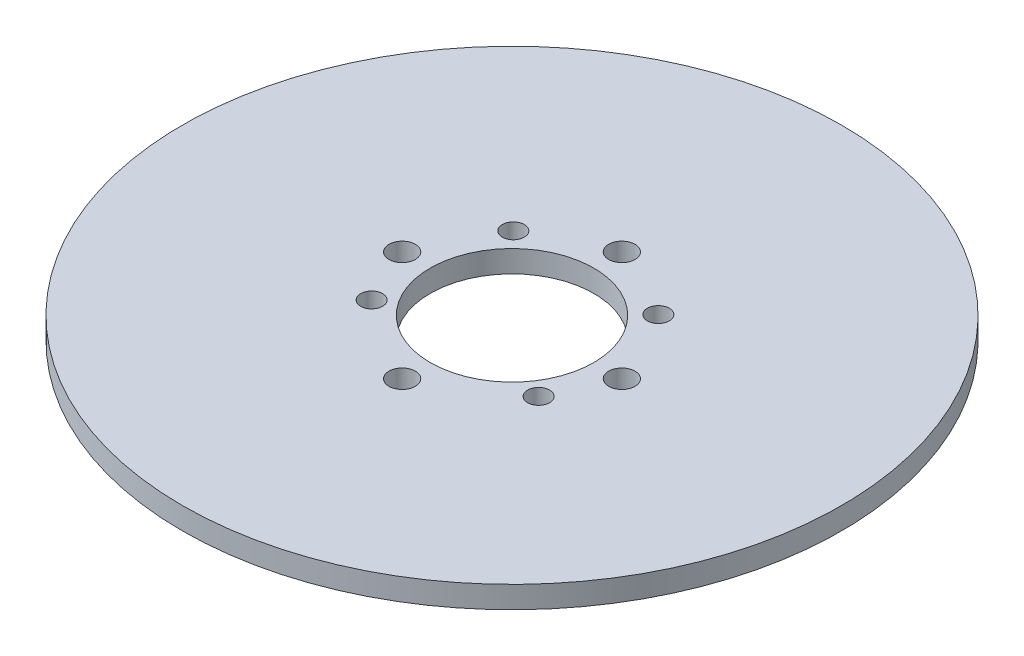
ISO-10303-21;
HEADER;
FILE_DESCRIPTION(('STEP AP214'),'2;1');
FILE_NAME('part.step','',(''),(''),'','','');
FILE_SCHEMA(('AUTOMOTIVE_DESIGN { 1 0 10303 214 1 1 1 1 }'));
ENDSEC;
DATA;
#1=APPLICATION_CONTEXT('core data for automotive mechanical design processes');
#2=APPLICATION_PROTOCOL_DEFINITION('international standard','automotive_design',2000,#1);
#3=PRODUCT_CONTEXT('',#1,'mechanical');
#4=PRODUCT('Part','Part','',(#3));
#5=PRODUCT_RELATED_PRODUCT_CATEGORY('part','',(#4));
#6=PRODUCT_DEFINITION_FORMATION('','',#4);
#7=PRODUCT_DEFINITION_CONTEXT('part definition',#1,'design');
#8=PRODUCT_DEFINITION('design','',#6,#7);
#9=PRODUCT_DEFINITION_SHAPE('','',#8);
#10=(LENGTH_UNIT() NAMED_UNIT(*) SI_UNIT(.MILLI.,.METRE.));
#11=(NAMED_UNIT(*) PLANE_ANGLE_UNIT() SI_UNIT($,.RADIAN.));
#12=(NAMED_UNIT(*) SI_UNIT($,.STERADIAN.) SOLID_ANGLE_UNIT());
#13=UNCERTAINTY_MEASURE_WITH_UNIT(LENGTH_MEASURE(1.E-05),#10,'distance_accuracy_value','');
#14=(GEOMETRIC_REPRESENTATION_CONTEXT(3) GLOBAL_UNCERTAINTY_ASSIGNED_CONTEXT((#13)) GLOBAL_UNIT_ASSIGNED_CONTEXT((#10,
#11,#12)) REPRESENTATION_CONTEXT('',''));
#15=CARTESIAN_POINT('',(0.,0.,0.));
#16=DIRECTION('',(0.,0.,1.));
#17=DIRECTION('',(1.,0.,0.));
#18=AXIS2_PLACEMENT_3D('',#15,#16,#17);
#19=CARTESIAN_POINT('',(-49.9999999999979,10.,3.00000000000159));
#20=DIRECTION('',(0.,-1.,0.));
#21=DIRECTION('',(0.,0.,-1.));
#22=AXIS2_PLACEMENT_3D('',#19,#20,#21);
#23=CYLINDRICAL_SURFACE('',#22,6.);
#24=CARTESIAN_POINT('',(-49.9999999999979,10.,3.00000000000159));
#25=DIRECTION('',(0.,1.,0.));
#26=DIRECTION('',(0.,0.,1.));
#27=AXIS2_PLACEMENT_3D('',#24,#25,#26);
#28=CIRCLE('',#27,6.);
#29=CARTESIAN_POINT('',(-49.9999999999979,10.,9.00000000000159));
#30=VERTEX_POINT('',#29);
#31=EDGE_CURVE('E41',#30,#30,#28,.T.);
#32=ORIENTED_EDGE('',*,*,#31,.T.);
#33=EDGE_LOOP('',(#32));
#34=FACE_BOUND('',#33,.T.);
#35=CARTESIAN_POINT('',(-49.9999999999979,0.,3.00000000000159));
#36=DIRECTION('',(0.,1.,0.));
#37=DIRECTION('',(0.,0.,1.));
#38=AXIS2_PLACEMENT_3D('',#35,#36,#37);
#39=CIRCLE('',#38,6.);
#40=CARTESIAN_POINT('',(-49.9999999999979,0.,9.00000000000159));
#41=VERTEX_POINT('',#40);
#42=EDGE_CURVE('E73',#41,#41,#39,.T.);
#43=ORIENTED_EDGE('',*,*,#42,.F.);
#44=EDGE_LOOP('',(#43));
#45=FACE_BOUND('',#44,.T.);
#46=ADVANCED_FACE('F33',(#34,#45),#23,.F.);
#47=CARTESIAN_POINT('',(3.89573857868908E-12,10.,53.));
#48=DIRECTION('',(0.,-1.,0.));
#49=DIRECTION('',(0.,0.,-1.));
#50=AXIS2_PLACEMENT_3D('',#47,#48,#49);
#51=CYLINDRICAL_SURFACE('',#50,6.);
#52=CARTESIAN_POINT('',(3.89573857868908E-12,10.,53.));
#53=DIRECTION('',(0.,1.,0.));
#54=DIRECTION('',(0.,0.,1.));
#55=AXIS2_PLACEMENT_3D('',#52,#53,#54);
#56=CIRCLE('',#55,6.);
#57=CARTESIAN_POINT('',(3.89573857868908E-12,10.,59.));
#58=VERTEX_POINT('',#57);
#59=EDGE_CURVE('E46',#58,#58,#56,.T.);
#60=ORIENTED_EDGE('',*,*,#59,.T.);
#61=EDGE_LOOP('',(#60));
#62=FACE_BOUND('',#61,.T.);
#63=CARTESIAN_POINT('',(3.89573857868908E-12,0.,53.));
#64=DIRECTION('',(0.,1.,0.));
#65=DIRECTION('',(0.,0.,1.));
#66=AXIS2_PLACEMENT_3D('',#63,#64,#65);
#67=CIRCLE('',#66,6.);
#68=CARTESIAN_POINT('',(3.89573857868908E-12,0.,59.));
#69=VERTEX_POINT('',#68);
#70=EDGE_CURVE('E71',#69,#69,#67,.T.);
#71=ORIENTED_EDGE('',*,*,#70,.F.);
#72=EDGE_LOOP('',(#71));
#73=FACE_BOUND('',#72,.T.);
#74=ADVANCED_FACE('F106',(#62,#73),#51,.F.);
#75=CARTESIAN_POINT('',(50.0000000000021,10.,2.99999999999806));
#76=DIRECTION('',(0.,-1.,0.));
#77=DIRECTION('',(0.,0.,-1.));
#78=AXIS2_PLACEMENT_3D('',#75,#76,#77);
#79=CYLINDRICAL_SURFACE('',#78,6.);
#80=CARTESIAN_POINT('',(50.0000000000021,10.,2.99999999999806));
#81=DIRECTION('',(0.,1.,0.));
#82=DIRECTION('',(0.,0.,1.));
#83=AXIS2_PLACEMENT_3D('',#80,#81,#82);
#84=CIRCLE('',#83,6.);
#85=CARTESIAN_POINT('',(50.0000000000021,10.,8.99999999999806));
#86=VERTEX_POINT('',#85);
#87=EDGE_CURVE('E101',#86,#86,#84,.T.);
#88=ORIENTED_EDGE('',*,*,#87,.T.);
#89=EDGE_LOOP('',(#88));
#90=FACE_BOUND('',#89,.T.);
#91=CARTESIAN_POINT('',(50.0000000000021,0.,2.99999999999806));
#92=DIRECTION('',(0.,1.,0.));
#93=DIRECTION('',(0.,0.,1.));
#94=AXIS2_PLACEMENT_3D('',#91,#92,#93);
#95=CIRCLE('',#94,6.);
#96=CARTESIAN_POINT('',(50.0000000000021,0.,8.99999999999806));
#97=VERTEX_POINT('',#96);
#98=EDGE_CURVE('E68',#97,#97,#95,.T.);
#99=ORIENTED_EDGE('',*,*,#98,.F.);
#100=EDGE_LOOP('',(#99));
#101=FACE_BOUND('',#100,.T.);
#102=ADVANCED_FACE('F124',(#90,#101),#79,.F.);
#103=CARTESIAN_POINT('',(0.,10.,-47.));
#104=DIRECTION('',(0.,-1.,0.));
#105=DIRECTION('',(0.,0.,-1.));
#106=AXIS2_PLACEMENT_3D('',#103,#104,#105);
#107=CYLINDRICAL_SURFACE('',#106,6.);
#108=CARTESIAN_POINT('',(0.,10.,-47.));
#109=DIRECTION('',(0.,1.,0.));
#110=DIRECTION('',(0.,0.,1.));
#111=AXIS2_PLACEMENT_3D('',#108,#109,#110);
#112=CIRCLE('',#111,6.);
#113=CARTESIAN_POINT('',(0.,10.,-41.));
#114=VERTEX_POINT('',#113);
#115=EDGE_CURVE('E98',#114,#114,#112,.T.);
#116=ORIENTED_EDGE('',*,*,#115,.T.);
#117=EDGE_LOOP('',(#116));
#118=FACE_BOUND('',#117,.T.);
#119=CARTESIAN_POINT('',(0.,0.,-47.));
#120=DIRECTION('',(0.,1.,0.));
#121=DIRECTION('',(0.,0.,1.));
#122=AXIS2_PLACEMENT_3D('',#119,#120,#121);
#123=CIRCLE('',#122,6.);
#124=CARTESIAN_POINT('',(0.,0.,-41.));
#125=VERTEX_POINT('',#124);
#126=EDGE_CURVE('E65',#125,#125,#123,.T.);
#127=ORIENTED_EDGE('',*,*,#126,.F.);
#128=EDGE_LOOP('',(#127));
#129=FACE_BOUND('',#128,.T.);
#130=ADVANCED_FACE('F131',(#118,#129),#107,.F.);
#131=CARTESIAN_POINT('',(0.,10.,3.));
#132=DIRECTION('',(0.,-1.,0.));
#133=DIRECTION('',(0.,0.,-1.));
#134=AXIS2_PLACEMENT_3D('',#131,#132,#133);
#135=CYLINDRICAL_SURFACE('',#134,37.25);
#136=CARTESIAN_POINT('',(0.,10.,3.));
#137=DIRECTION('',(0.,1.,0.));
#138=DIRECTION('',(0.,0.,1.));
#139=AXIS2_PLACEMENT_3D('',#136,#137,#138);
#140=CIRCLE('',#139,37.25);
#141=CARTESIAN_POINT('',(0.,10.,40.25));
#142=VERTEX_POINT('',#141);
#143=EDGE_CURVE('E95',#142,#142,#140,.T.);
#144=ORIENTED_EDGE('',*,*,#143,.T.);
#145=EDGE_LOOP('',(#144));
#146=FACE_BOUND('',#145,.T.);
#147=CARTESIAN_POINT('',(0.,0.,3.));
#148=DIRECTION('',(0.,1.,0.));
#149=DIRECTION('',(0.,0.,1.));
#150=AXIS2_PLACEMENT_3D('',#147,#148,#149);
#151=CIRCLE('',#150,37.25);
#152=CARTESIAN_POINT('',(0.,0.,40.25));
#153=VERTEX_POINT('',#152);
#154=EDGE_CURVE('E62',#153,#153,#151,.T.);
#155=ORIENTED_EDGE('',*,*,#154,.F.);
#156=EDGE_LOOP('',(#155));
#157=FACE_BOUND('',#156,.T.);
#158=ADVANCED_FACE('F135',(#146,#157),#135,.F.);
#159=CARTESIAN_POINT('',(-38.,10.,28.8961342206525));
#160=DIRECTION('',(0.,-1.,0.));
#161=DIRECTION('',(0.,0.,-1.));
#162=AXIS2_PLACEMENT_3D('',#159,#160,#161);
#163=CYLINDRICAL_SURFACE('',#162,5.);
#164=CARTESIAN_POINT('',(-38.,10.,28.8961342206525));
#165=DIRECTION('',(0.,1.,0.));
#166=DIRECTION('',(0.,0.,1.));
#167=AXIS2_PLACEMENT_3D('',#164,#165,#166);
#168=CIRCLE('',#167,5.);
#169=CARTESIAN_POINT('',(-38.,10.,33.8961342206525));
#170=VERTEX_POINT('',#169);
#171=EDGE_CURVE('E92',#170,#170,#168,.T.);
#172=ORIENTED_EDGE('',*,*,#171,.T.);
#173=EDGE_LOOP('',(#172));
#174=FACE_BOUND('',#173,.T.);
#175=CARTESIAN_POINT('',(-38.,0.,28.8961342206525));
#176=DIRECTION('',(0.,1.,0.));
#177=DIRECTION('',(0.,0.,1.));
#178=AXIS2_PLACEMENT_3D('',#175,#176,#177);
#179=CIRCLE('',#178,5.);
#180=CARTESIAN_POINT('',(-38.,0.,33.8961342206525));
#181=VERTEX_POINT('',#180);
#182=EDGE_CURVE('E59',#181,#181,#179,.T.);
#183=ORIENTED_EDGE('',*,*,#182,.F.);
#184=EDGE_LOOP('',(#183));
#185=FACE_BOUND('',#184,.T.);
#186=ADVANCED_FACE('F139',(#174,#185),#163,.F.);
#187=CARTESIAN_POINT('',(38.,10.,28.8961342206525));
#188=DIRECTION('',(0.,-1.,0.));
#189=DIRECTION('',(0.,0.,-1.));
#190=AXIS2_PLACEMENT_3D('',#187,#188,#189);
#191=CYLINDRICAL_SURFACE('',#190,4.99999999999999);
#192=CARTESIAN_POINT('',(38.,10.,28.8961342206525));
#193=DIRECTION('',(0.,1.,0.));
#194=DIRECTION('',(0.,0.,1.));
#195=AXIS2_PLACEMENT_3D('',#192,#193,#194);
#196=CIRCLE('',#195,4.99999999999999);
#197=CARTESIAN_POINT('',(38.,10.,33.8961342206525));
#198=VERTEX_POINT('',#197);
#199=EDGE_CURVE('E87',#198,#198,#196,.T.);
#200=ORIENTED_EDGE('',*,*,#199,.T.);
#201=EDGE_LOOP('',(#200));
#202=FACE_BOUND('',#201,.T.);
#203=CARTESIAN_POINT('',(38.,0.,28.8961342206525));
#204=DIRECTION('',(0.,1.,0.));
#205=DIRECTION('',(0.,0.,1.));
#206=AXIS2_PLACEMENT_3D('',#203,#204,#205);
#207=CIRCLE('',#206,4.99999999999999);
#208=CARTESIAN_POINT('',(38.,0.,33.8961342206525));
#209=VERTEX_POINT('',#208);
#210=EDGE_CURVE('E56',#209,#209,#207,.T.);
#211=ORIENTED_EDGE('',*,*,#210,.F.);
#212=EDGE_LOOP('',(#211));
#213=FACE_BOUND('',#212,.T.);
#214=ADVANCED_FACE('F143',(#202,#213),#191,.F.);
#215=CARTESIAN_POINT('',(33.,10.,-30.5941170815567));
#216=DIRECTION('',(0.,-1.,0.));
#217=DIRECTION('',(0.,0.,-1.));
#218=AXIS2_PLACEMENT_3D('',#215,#216,#217);
#219=CYLINDRICAL_SURFACE('',#218,5.00000000000001);
#220=CARTESIAN_POINT('',(33.,10.,-30.5941170815567));
#221=DIRECTION('',(0.,1.,0.));
#222=DIRECTION('',(0.,0.,1.));
#223=AXIS2_PLACEMENT_3D('',#220,#221,#222);
#224=CIRCLE('',#223,5.00000000000001);
#225=CARTESIAN_POINT('',(33.,10.,-25.5941170815567));
#226=VERTEX_POINT('',#225);
#227=EDGE_CURVE('E82',#226,#226,#224,.T.);
#228=ORIENTED_EDGE('',*,*,#227,.T.);
#229=EDGE_LOOP('',(#228));
#230=FACE_BOUND('',#229,.T.);
#231=CARTESIAN_POINT('',(33.,0.,-30.5941170815567));
#232=DIRECTION('',(0.,1.,0.));
#233=DIRECTION('',(0.,0.,1.));
#234=AXIS2_PLACEMENT_3D('',#231,#232,#233);
#235=CIRCLE('',#234,5.00000000000001);
#236=CARTESIAN_POINT('',(33.,0.,-25.5941170815567));
#237=VERTEX_POINT('',#236);
#238=EDGE_CURVE('E53',#237,#237,#235,.T.);
#239=ORIENTED_EDGE('',*,*,#238,.F.);
#240=EDGE_LOOP('',(#239));
#241=FACE_BOUND('',#240,.T.);
#242=ADVANCED_FACE('F146',(#230,#241),#219,.F.);
#243=CARTESIAN_POINT('',(-33.,10.,-30.5941170815567));
#244=DIRECTION('',(0.,-1.,0.));
#245=DIRECTION('',(0.,0.,-1.));
#246=AXIS2_PLACEMENT_3D('',#243,#244,#245);
#247=CYLINDRICAL_SURFACE('',#246,5.);
#248=CARTESIAN_POINT('',(-33.,10.,-30.5941170815567));
#249=DIRECTION('',(0.,1.,0.));
#250=DIRECTION('',(0.,0.,1.));
#251=AXIS2_PLACEMENT_3D('',#248,#249,#250);
#252=CIRCLE('',#251,5.);
#253=CARTESIAN_POINT('',(-33.,10.,-25.5941170815567));
#254=VERTEX_POINT('',#253);
#255=EDGE_CURVE('E78',#254,#254,#252,.T.);
#256=ORIENTED_EDGE('',*,*,#255,.T.);
#257=EDGE_LOOP('',(#256));
#258=FACE_BOUND('',#257,.T.);
#259=CARTESIAN_POINT('',(-33.,0.,-30.5941170815567));
#260=DIRECTION('',(0.,1.,0.));
#261=DIRECTION('',(0.,0.,1.));
#262=AXIS2_PLACEMENT_3D('',#259,#260,#261);
#263=CIRCLE('',#262,5.);
#264=CARTESIAN_POINT('',(-33.,0.,-25.5941170815567));
#265=VERTEX_POINT('',#264);
#266=EDGE_CURVE('E50',#265,#265,#263,.T.);
#267=ORIENTED_EDGE('',*,*,#266,.F.);
#268=EDGE_LOOP('',(#267));
#269=FACE_BOUND('',#268,.T.);
#270=ADVANCED_FACE('F35',(#258,#269),#247,.F.);
#271=CARTESIAN_POINT('',(0.,10.,3.));
#272=DIRECTION('',(0.,-1.,0.));
#273=DIRECTION('',(0.,0.,-1.));
#274=AXIS2_PLACEMENT_3D('',#271,#272,#273);
#275=CYLINDRICAL_SURFACE('',#274,150.);
#276=CARTESIAN_POINT('',(0.,10.,3.));
#277=DIRECTION('',(0.,1.,0.));
#278=DIRECTION('',(0.,0.,1.));
#279=AXIS2_PLACEMENT_3D('',#276,#277,#278);
#280=CIRCLE('',#279,150.);
#281=CARTESIAN_POINT('',(0.,10.,153.));
#282=VERTEX_POINT('',#281);
#283=EDGE_CURVE('E10',#282,#282,#280,.T.);
#284=ORIENTED_EDGE('',*,*,#283,.F.);
#285=EDGE_LOOP('',(#284));
#286=FACE_BOUND('',#285,.T.);
#287=CARTESIAN_POINT('',(0.,0.,3.));
#288=DIRECTION('',(0.,1.,0.));
#289=DIRECTION('',(0.,0.,1.));
#290=AXIS2_PLACEMENT_3D('',#287,#288,#289);
#291=CIRCLE('',#290,150.);
#292=CARTESIAN_POINT('',(0.,0.,153.));
#293=VERTEX_POINT('',#292);
#294=EDGE_CURVE('E37',#293,#293,#291,.T.);
#295=ORIENTED_EDGE('',*,*,#294,.T.);
#296=EDGE_LOOP('',(#295));
#297=FACE_BOUND('',#296,.T.);
#298=ADVANCED_FACE('F113',(#286,#297),#275,.T.);
#299=CARTESIAN_POINT('',(0.,10.,0.));
#300=DIRECTION('',(0.,1.,0.));
#301=DIRECTION('',(0.,0.,1.));
#302=AXIS2_PLACEMENT_3D('',#299,#300,#301);
#303=PLANE('',#302);
#304=ORIENTED_EDGE('',*,*,#255,.F.);
#305=EDGE_LOOP('',(#304));
#306=FACE_BOUND('',#305,.T.);
#307=ORIENTED_EDGE('',*,*,#227,.F.);
#308=EDGE_LOOP('',(#307));
#309=FACE_BOUND('',#308,.T.);
#310=ORIENTED_EDGE('',*,*,#199,.F.);
#311=EDGE_LOOP('',(#310));
#312=FACE_BOUND('',#311,.T.);
#313=ORIENTED_EDGE('',*,*,#171,.F.);
#314=EDGE_LOOP('',(#313));
#315=FACE_BOUND('',#314,.T.);
#316=ORIENTED_EDGE('',*,*,#143,.F.);
#317=EDGE_LOOP('',(#316));
#318=FACE_BOUND('',#317,.T.);
#319=ORIENTED_EDGE('',*,*,#115,.F.);
#320=EDGE_LOOP('',(#319));
#321=FACE_BOUND('',#320,.T.);
#322=ORIENTED_EDGE('',*,*,#87,.F.);
#323=EDGE_LOOP('',(#322));
#324=FACE_BOUND('',#323,.T.);
#325=ORIENTED_EDGE('',*,*,#59,.F.);
#326=EDGE_LOOP('',(#325));
#327=FACE_BOUND('',#326,.T.);
#328=ORIENTED_EDGE('',*,*,#31,.F.);
#329=EDGE_LOOP('',(#328));
#330=FACE_BOUND('',#329,.T.);
#331=ORIENTED_EDGE('',*,*,#283,.T.);
#332=EDGE_LOOP('',(#331));
#333=FACE_BOUND('',#332,.T.);
#334=ADVANCED_FACE('F109',(#306,#309,#312,#315,#318,#321,#324,#327,#330,#333),#303,.T.);
#335=CARTESIAN_POINT('',(0.,0.,0.));
#336=DIRECTION('',(0.,1.,0.));
#337=DIRECTION('',(0.,0.,1.));
#338=AXIS2_PLACEMENT_3D('',#335,#336,#337);
#339=PLANE('',#338);
#340=ORIENTED_EDGE('',*,*,#266,.T.);
#341=EDGE_LOOP('',(#340));
#342=FACE_BOUND('',#341,.T.);
#343=ORIENTED_EDGE('',*,*,#238,.T.);
#344=EDGE_LOOP('',(#343));
#345=FACE_BOUND('',#344,.T.);
#346=ORIENTED_EDGE('',*,*,#210,.T.);
#347=EDGE_LOOP('',(#346));
#348=FACE_BOUND('',#347,.T.);
#349=ORIENTED_EDGE('',*,*,#182,.T.);
#350=EDGE_LOOP('',(#349));
#351=FACE_BOUND('',#350,.T.);
#352=ORIENTED_EDGE('',*,*,#154,.T.);
#353=EDGE_LOOP('',(#352));
#354=FACE_BOUND('',#353,.T.);
#355=ORIENTED_EDGE('',*,*,#126,.T.);
#356=EDGE_LOOP('',(#355));
#357=FACE_BOUND('',#356,.T.);
#358=ORIENTED_EDGE('',*,*,#98,.T.);
#359=EDGE_LOOP('',(#358));
#360=FACE_BOUND('',#359,.T.);
#361=ORIENTED_EDGE('',*,*,#70,.T.);
#362=EDGE_LOOP('',(#361));
#363=FACE_BOUND('',#362,.T.);
#364=ORIENTED_EDGE('',*,*,#42,.T.);
#365=EDGE_LOOP('',(#364));
#366=FACE_BOUND('',#365,.T.);
#367=ORIENTED_EDGE('',*,*,#294,.F.);
#368=EDGE_LOOP('',(#367));
#369=FACE_BOUND('',#368,.T.);
#370=ADVANCED_FACE('F112',(#342,#345,#348,#351,#354,#357,#360,#363,#366,#369),#339,.F.);
#371=CLOSED_SHELL('',(#46,#74,#102,#130,#158,#186,#214,#242,#270,#298,#334,#370));
#372=MANIFOLD_SOLID_BREP('B2',#371);
#373=ADVANCED_BREP_SHAPE_REPRESENTATION('',(#18,#372),#14);
#374=SHAPE_DEFINITION_REPRESENTATION(#9,#373);
ENDSEC;
END-ISO-10303-21;
